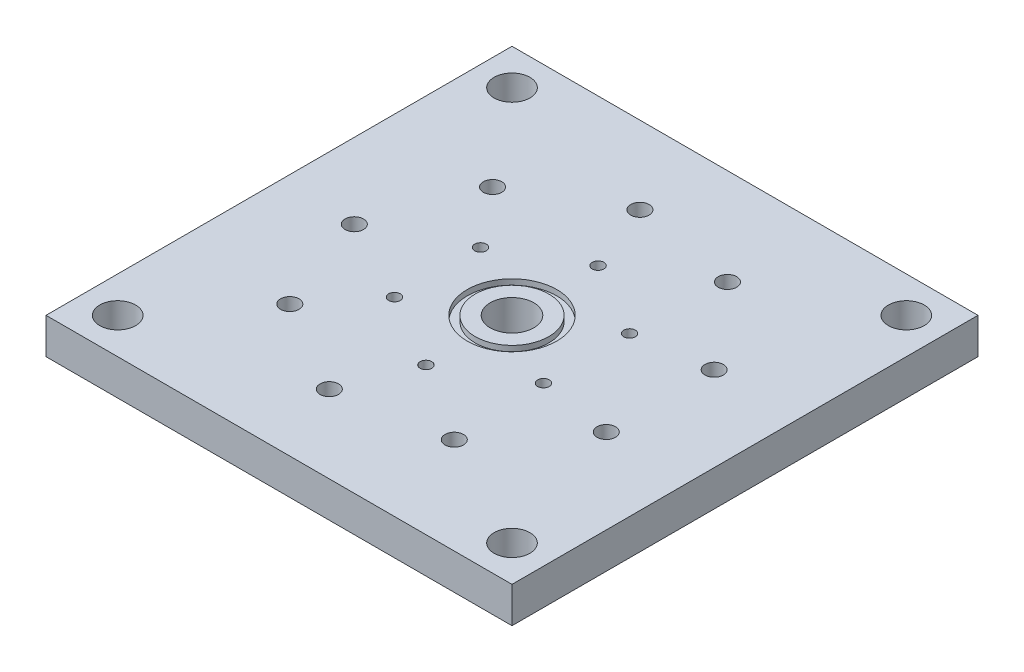
ISO-10303-21;
HEADER;
FILE_DESCRIPTION(('STEP AP214'),'2;1');
FILE_NAME('part.step','',(''),(''),'','','');
FILE_SCHEMA(('AUTOMOTIVE_DESIGN { 1 0 10303 214 1 1 1 1 }'));
ENDSEC;
DATA;
#1=APPLICATION_CONTEXT('core data for automotive mechanical design processes');
#2=APPLICATION_PROTOCOL_DEFINITION('international standard','automotive_design',2000,#1);
#3=PRODUCT_CONTEXT('',#1,'mechanical');
#4=PRODUCT('Part','Part','',(#3));
#5=PRODUCT_RELATED_PRODUCT_CATEGORY('part','',(#4));
#6=PRODUCT_DEFINITION_FORMATION('','',#4);
#7=PRODUCT_DEFINITION_CONTEXT('part definition',#1,'design');
#8=PRODUCT_DEFINITION('design','',#6,#7);
#9=PRODUCT_DEFINITION_SHAPE('','',#8);
#10=(LENGTH_UNIT() NAMED_UNIT(*) SI_UNIT(.MILLI.,.METRE.));
#11=(NAMED_UNIT(*) PLANE_ANGLE_UNIT() SI_UNIT($,.RADIAN.));
#12=(NAMED_UNIT(*) SI_UNIT($,.STERADIAN.) SOLID_ANGLE_UNIT());
#13=UNCERTAINTY_MEASURE_WITH_UNIT(LENGTH_MEASURE(1.E-05),#10,'distance_accuracy_value','');
#14=(GEOMETRIC_REPRESENTATION_CONTEXT(3) GLOBAL_UNCERTAINTY_ASSIGNED_CONTEXT((#13)) GLOBAL_UNIT_ASSIGNED_CONTEXT((#10,
#11,#12)) REPRESENTATION_CONTEXT('',''));
#15=CARTESIAN_POINT('',(0.,0.,0.));
#16=DIRECTION('',(0.,0.,1.));
#17=DIRECTION('',(1.,0.,0.));
#18=AXIS2_PLACEMENT_3D('',#15,#16,#17);
#19=CARTESIAN_POINT('',(0.,6.35,0.));
#20=DIRECTION('',(0.,-1.,0.));
#21=DIRECTION('',(0.,0.,-1.));
#22=AXIS2_PLACEMENT_3D('',#19,#20,#21);
#23=PLANE('',#22);
#24=CARTESIAN_POINT('',(0.,6.35,0.));
#25=DIRECTION('',(0.,1.,0.));
#26=DIRECTION('',(0.,0.,1.));
#27=AXIS2_PLACEMENT_3D('',#24,#25,#26);
#28=CIRCLE('',#27,3.8608);
#29=CARTESIAN_POINT('',(0.,6.35,3.8608));
#30=VERTEX_POINT('',#29);
#31=EDGE_CURVE('E100',#30,#30,#28,.T.);
#32=ORIENTED_EDGE('',*,*,#31,.F.);
#33=EDGE_LOOP('',(#32));
#34=FACE_BOUND('',#33,.T.);
#35=CARTESIAN_POINT('',(0.,6.35,0.));
#36=DIRECTION('',(0.,1.,0.));
#37=DIRECTION('',(0.,0.,1.));
#38=AXIS2_PLACEMENT_3D('',#35,#36,#37);
#39=CIRCLE('',#38,6.5278);
#40=CARTESIAN_POINT('',(0.,6.35,6.5278));
#41=VERTEX_POINT('',#40);
#42=EDGE_CURVE('E123',#41,#41,#39,.T.);
#43=ORIENTED_EDGE('',*,*,#42,.T.);
#44=EDGE_LOOP('',(#43));
#45=FACE_BOUND('',#44,.T.);
#46=ADVANCED_FACE('F33',(#34,#45),#23,.F.);
#47=CARTESIAN_POINT('',(41.275,6.35,41.275));
#48=DIRECTION('',(-1.,0.,0.));
#49=DIRECTION('',(0.,0.,1.));
#50=AXIS2_PLACEMENT_3D('',#47,#48,#49);
#51=PLANE('',#50);
#52=DIRECTION('',(0.,0.,-1.));
#53=VECTOR('',#52,1.);
#54=CARTESIAN_POINT('',(41.275,0.,41.275));
#55=LINE('',#54,#53);
#56=CARTESIAN_POINT('',(41.275,0.,41.275));
#57=VERTEX_POINT('',#56);
#58=CARTESIAN_POINT('',(41.275,0.,-41.275));
#59=VERTEX_POINT('',#58);
#60=EDGE_CURVE('E97',#57,#59,#55,.T.);
#61=ORIENTED_EDGE('',*,*,#60,.T.);
#62=DIRECTION('',(0.,-1.,0.));
#63=VECTOR('',#62,1.);
#64=CARTESIAN_POINT('',(41.275,6.35,-41.275));
#65=LINE('',#64,#63);
#66=CARTESIAN_POINT('',(41.275,6.35,-41.275));
#67=VERTEX_POINT('',#66);
#68=EDGE_CURVE('E11',#67,#59,#65,.T.);
#69=ORIENTED_EDGE('',*,*,#68,.F.);
#70=DIRECTION('',(0.,0.,-1.));
#71=VECTOR('',#70,1.);
#72=CARTESIAN_POINT('',(41.275,6.35,41.275));
#73=LINE('',#72,#71);
#74=CARTESIAN_POINT('',(41.275,6.35,41.275));
#75=VERTEX_POINT('',#74);
#76=EDGE_CURVE('E85',#75,#67,#73,.T.);
#77=ORIENTED_EDGE('',*,*,#76,.F.);
#78=DIRECTION('',(0.,-1.,0.));
#79=VECTOR('',#78,1.);
#80=CARTESIAN_POINT('',(41.275,6.35,41.275));
#81=LINE('',#80,#79);
#82=EDGE_CURVE('E93',#75,#57,#81,.T.);
#83=ORIENTED_EDGE('',*,*,#82,.T.);
#84=EDGE_LOOP('',(#61,#69,#77,#83));
#85=FACE_BOUND('',#84,.T.);
#86=ADVANCED_FACE('F35',(#85),#51,.F.);
#87=CARTESIAN_POINT('',(-41.275,6.35,-41.275));
#88=DIRECTION('',(0.,0.,1.));
#89=DIRECTION('',(1.,0.,0.));
#90=AXIS2_PLACEMENT_3D('',#87,#88,#89);
#91=PLANE('',#90);
#92=DIRECTION('',(-1.,0.,0.));
#93=VECTOR('',#92,1.);
#94=CARTESIAN_POINT('',(-41.275,0.,-41.275));
#95=LINE('',#94,#93);
#96=CARTESIAN_POINT('',(-41.275,0.,-41.275));
#97=VERTEX_POINT('',#96);
#98=EDGE_CURVE('E89',#59,#97,#95,.T.);
#99=ORIENTED_EDGE('',*,*,#98,.T.);
#100=DIRECTION('',(0.,-1.,0.));
#101=VECTOR('',#100,1.);
#102=CARTESIAN_POINT('',(-41.275,6.35,-41.275));
#103=LINE('',#102,#101);
#104=CARTESIAN_POINT('',(-41.275,6.35,-41.275));
#105=VERTEX_POINT('',#104);
#106=EDGE_CURVE('E42',#105,#97,#103,.T.);
#107=ORIENTED_EDGE('',*,*,#106,.F.);
#108=DIRECTION('',(-1.,0.,0.));
#109=VECTOR('',#108,1.);
#110=CARTESIAN_POINT('',(-41.275,6.35,-41.275));
#111=LINE('',#110,#109);
#112=EDGE_CURVE('E80',#67,#105,#111,.T.);
#113=ORIENTED_EDGE('',*,*,#112,.F.);
#114=ORIENTED_EDGE('',*,*,#68,.T.);
#115=EDGE_LOOP('',(#99,#107,#113,#114));
#116=FACE_BOUND('',#115,.T.);
#117=ADVANCED_FACE('F88',(#116),#91,.F.);
#118=CARTESIAN_POINT('',(-41.275,6.35,41.275));
#119=DIRECTION('',(1.,0.,0.));
#120=DIRECTION('',(0.,0.,-1.));
#121=AXIS2_PLACEMENT_3D('',#118,#119,#120);
#122=PLANE('',#121);
#123=DIRECTION('',(0.,0.,1.));
#124=VECTOR('',#123,1.);
#125=CARTESIAN_POINT('',(-41.275,0.,41.275));
#126=LINE('',#125,#124);
#127=CARTESIAN_POINT('',(-41.275,0.,41.275));
#128=VERTEX_POINT('',#127);
#129=EDGE_CURVE('E67',#97,#128,#126,.T.);
#130=ORIENTED_EDGE('',*,*,#129,.T.);
#131=DIRECTION('',(0.,-1.,0.));
#132=VECTOR('',#131,1.);
#133=CARTESIAN_POINT('',(-41.275,6.35,41.275));
#134=LINE('',#133,#132);
#135=CARTESIAN_POINT('',(-41.275,6.35,41.275));
#136=VERTEX_POINT('',#135);
#137=EDGE_CURVE('E90',#136,#128,#134,.T.);
#138=ORIENTED_EDGE('',*,*,#137,.F.);
#139=DIRECTION('',(0.,0.,1.));
#140=VECTOR('',#139,1.);
#141=CARTESIAN_POINT('',(-41.275,6.35,41.275));
#142=LINE('',#141,#140);
#143=EDGE_CURVE('E83',#105,#136,#142,.T.);
#144=ORIENTED_EDGE('',*,*,#143,.F.);
#145=ORIENTED_EDGE('',*,*,#106,.T.);
#146=EDGE_LOOP('',(#130,#138,#144,#145));
#147=FACE_BOUND('',#146,.T.);
#148=ADVANCED_FACE('F91',(#147),#122,.F.);
#149=CARTESIAN_POINT('',(-41.275,6.35,41.275));
#150=DIRECTION('',(0.,0.,-1.));
#151=DIRECTION('',(-1.,0.,0.));
#152=AXIS2_PLACEMENT_3D('',#149,#150,#151);
#153=PLANE('',#152);
#154=DIRECTION('',(1.,0.,0.));
#155=VECTOR('',#154,1.);
#156=CARTESIAN_POINT('',(-41.275,0.,41.275));
#157=LINE('',#156,#155);
#158=EDGE_CURVE('E73',#128,#57,#157,.T.);
#159=ORIENTED_EDGE('',*,*,#158,.T.);
#160=ORIENTED_EDGE('',*,*,#82,.F.);
#161=DIRECTION('',(1.,0.,0.));
#162=VECTOR('',#161,1.);
#163=CARTESIAN_POINT('',(-41.275,6.35,41.275));
#164=LINE('',#163,#162);
#165=EDGE_CURVE('E50',#136,#75,#164,.T.);
#166=ORIENTED_EDGE('',*,*,#165,.F.);
#167=ORIENTED_EDGE('',*,*,#137,.T.);
#168=EDGE_LOOP('',(#159,#160,#166,#167));
#169=FACE_BOUND('',#168,.T.);
#170=ADVANCED_FACE('F105',(#169),#153,.F.);
#171=CARTESIAN_POINT('',(-34.925,6.35,-34.925));
#172=DIRECTION('',(0.,1.,0.));
#173=DIRECTION('',(0.,0.,-1.));
#174=AXIS2_PLACEMENT_3D('',#171,#172,#173);
#175=CIRCLE('',#174,3.175);
#176=CARTESIAN_POINT('',(-34.925,6.35,-38.1));
#177=VERTEX_POINT('',#176);
#178=EDGE_CURVE('E234',#177,#177,#175,.T.);
#179=ORIENTED_EDGE('',*,*,#178,.F.);
#180=EDGE_LOOP('',(#179));
#181=FACE_BOUND('',#180,.T.);
#182=CARTESIAN_POINT('',(-34.925,6.35,34.925));
#183=DIRECTION('',(0.,1.,0.));
#184=DIRECTION('',(0.,0.,1.));
#185=AXIS2_PLACEMENT_3D('',#182,#183,#184);
#186=CIRCLE('',#185,3.175);
#187=CARTESIAN_POINT('',(-34.925,6.35,38.1));
#188=VERTEX_POINT('',#187);
#189=EDGE_CURVE('E228',#188,#188,#186,.T.);
#190=ORIENTED_EDGE('',*,*,#189,.F.);
#191=EDGE_LOOP('',(#190));
#192=FACE_BOUND('',#191,.T.);
#193=CARTESIAN_POINT('',(34.925,6.35,34.925));
#194=DIRECTION('',(0.,1.,0.));
#195=DIRECTION('',(0.,0.,-1.));
#196=AXIS2_PLACEMENT_3D('',#193,#194,#195);
#197=CIRCLE('',#196,3.175);
#198=CARTESIAN_POINT('',(34.925,6.35,31.75));
#199=VERTEX_POINT('',#198);
#200=EDGE_CURVE('E222',#199,#199,#197,.T.);
#201=ORIENTED_EDGE('',*,*,#200,.F.);
#202=EDGE_LOOP('',(#201));
#203=FACE_BOUND('',#202,.T.);
#204=CARTESIAN_POINT('',(34.925,6.35,-34.925));
#205=DIRECTION('',(0.,1.,0.));
#206=DIRECTION('',(0.,0.,1.));
#207=AXIS2_PLACEMENT_3D('',#204,#205,#206);
#208=CIRCLE('',#207,3.175);
#209=CARTESIAN_POINT('',(34.925,6.35,-31.75));
#210=VERTEX_POINT('',#209);
#211=EDGE_CURVE('E216',#210,#210,#208,.T.);
#212=ORIENTED_EDGE('',*,*,#211,.F.);
#213=EDGE_LOOP('',(#212));
#214=FACE_BOUND('',#213,.T.);
#215=CARTESIAN_POINT('',(-4.8517300840137,6.35,27.5155286191612));
#216=DIRECTION('',(0.,1.,0.));
#217=DIRECTION('',(-0.64278760968653,0.,0.766044443118986));
#218=AXIS2_PLACEMENT_3D('',#215,#216,#217);
#219=CIRCLE('',#218,1.63195);
#220=CARTESIAN_POINT('',(-5.90072732364164,6.35,28.7656748481092));
#221=VERTEX_POINT('',#220);
#222=EDGE_CURVE('E210',#221,#221,#219,.T.);
#223=ORIENTED_EDGE('',*,*,#222,.F.);
#224=EDGE_LOOP('',(#223));
#225=FACE_BOUND('',#224,.T.);
#226=CARTESIAN_POINT('',(-21.4032817407441,6.35,17.9594858146421));
#227=DIRECTION('',(0.,1.,0.));
#228=DIRECTION('',(-0.984807753012206,0.,0.17364817766694));
#229=AXIS2_PLACEMENT_3D('',#226,#227,#228);
#230=CIRCLE('',#229,1.63195);
#231=CARTESIAN_POINT('',(-23.0104387532723,6.35,18.2428709581857));
#232=VERTEX_POINT('',#231);
#233=EDGE_CURVE('E204',#232,#232,#230,.T.);
#234=ORIENTED_EDGE('',*,*,#233,.F.);
#235=EDGE_LOOP('',(#234));
#236=FACE_BOUND('',#235,.T.);
#237=CARTESIAN_POINT('',(-27.94,6.35,2.60208521396521E-13));
#238=DIRECTION('',(0.,1.,0.));
#239=DIRECTION('',(-0.866025403784443,0.,-0.499999999999992));
#240=AXIS2_PLACEMENT_3D('',#237,#238,#239);
#241=CIRCLE('',#240,1.63195);
#242=CARTESIAN_POINT('',(-29.353310157706,6.35,-0.815974999999728));
#243=VERTEX_POINT('',#242);
#244=EDGE_CURVE('E198',#243,#243,#241,.T.);
#245=ORIENTED_EDGE('',*,*,#244,.F.);
#246=EDGE_LOOP('',(#245));
#247=FACE_BOUND('',#246,.T.);
#248=CARTESIAN_POINT('',(-21.4032817407444,6.35,-17.9594858146418));
#249=DIRECTION('',(0.,1.,0.));
#250=DIRECTION('',(-0.342020143325676,0.,-0.939692620785906));
#251=AXIS2_PLACEMENT_3D('',#248,#249,#250);
#252=CIRCLE('',#251,1.63195);
#253=CARTESIAN_POINT('',(-21.9614415136447,6.35,-19.4930171871333));
#254=VERTEX_POINT('',#253);
#255=EDGE_CURVE('E192',#254,#254,#252,.T.);
#256=ORIENTED_EDGE('',*,*,#255,.F.);
#257=EDGE_LOOP('',(#256));
#258=FACE_BOUND('',#257,.T.);
#259=CARTESIAN_POINT('',(-4.8517300840142,6.35,-27.5155286191611));
#260=DIRECTION('',(0.,1.,0.));
#261=DIRECTION('',(0.342020143325663,0.,-0.939692620785911));
#262=AXIS2_PLACEMENT_3D('',#259,#260,#261);
#263=CIRCLE('',#262,1.63195);
#264=CARTESIAN_POINT('',(-4.29357031111389,6.35,-29.0490599916526));
#265=VERTEX_POINT('',#264);
#266=EDGE_CURVE('E186',#265,#265,#263,.T.);
#267=ORIENTED_EDGE('',*,*,#266,.F.);
#268=EDGE_LOOP('',(#267));
#269=FACE_BOUND('',#268,.T.);
#270=CARTESIAN_POINT('',(13.9699999999999,6.35,-24.1967497817373));
#271=DIRECTION('',(0.,1.,0.));
#272=DIRECTION('',(0.866025403784436,0.,-0.500000000000004));
#273=AXIS2_PLACEMENT_3D('',#270,#271,#272);
#274=CIRCLE('',#273,1.63195);
#275=CARTESIAN_POINT('',(15.3833101577059,6.35,-25.0127247817373));
#276=VERTEX_POINT('',#275);
#277=EDGE_CURVE('E180',#276,#276,#274,.T.);
#278=ORIENTED_EDGE('',*,*,#277,.F.);
#279=EDGE_LOOP('',(#278));
#280=FACE_BOUND('',#279,.T.);
#281=CARTESIAN_POINT('',(26.2550118247583,6.35,-9.55604280451927));
#282=DIRECTION('',(0.,1.,0.));
#283=DIRECTION('',(0.984807753012209,0.,0.173648177666927));
#284=AXIS2_PLACEMENT_3D('',#281,#282,#283);
#285=CIRCLE('',#284,1.63195);
#286=CARTESIAN_POINT('',(27.8621688372865,6.35,-9.27265766097573));
#287=VERTEX_POINT('',#286);
#288=EDGE_CURVE('E174',#287,#287,#285,.T.);
#289=ORIENTED_EDGE('',*,*,#288,.F.);
#290=EDGE_LOOP('',(#289));
#291=FACE_BOUND('',#290,.T.);
#292=CARTESIAN_POINT('',(26.2550118247583,6.35,9.55604280451915));
#293=DIRECTION('',(0.,1.,0.));
#294=DIRECTION('',(0.642787609686541,0.,0.766044443118977));
#295=AXIS2_PLACEMENT_3D('',#292,#293,#294);
#296=CIRCLE('',#295,1.63195);
#297=CARTESIAN_POINT('',(27.3040090643863,6.35,10.8061890334672));
#298=VERTEX_POINT('',#297);
#299=EDGE_CURVE('E168',#298,#298,#296,.T.);
#300=ORIENTED_EDGE('',*,*,#299,.F.);
#301=EDGE_LOOP('',(#300));
#302=FACE_BOUND('',#301,.T.);
#303=CARTESIAN_POINT('',(13.97,6.35,24.1967497817372));
#304=DIRECTION('',(0.,1.,0.));
#305=DIRECTION('',(0.,0.,1.));
#306=AXIS2_PLACEMENT_3D('',#303,#304,#305);
#307=CIRCLE('',#306,1.63195);
#308=CARTESIAN_POINT('',(13.97,6.35,25.8286997817372));
#309=VERTEX_POINT('',#308);
#310=EDGE_CURVE('E162',#309,#309,#307,.T.);
#311=ORIENTED_EDGE('',*,*,#310,.F.);
#312=EDGE_LOOP('',(#311));
#313=FACE_BOUND('',#312,.T.);
#314=CARTESIAN_POINT('',(-13.1982271536748,6.35,7.62000000000015));
#315=DIRECTION('',(0.,1.,0.));
#316=DIRECTION('',(-0.866025403784433,0.,0.50000000000001));
#317=AXIS2_PLACEMENT_3D('',#314,#315,#316);
#318=CIRCLE('',#317,1.03251);
#319=CARTESIAN_POINT('',(-14.0924070433362,6.35,8.13625500000017));
#320=VERTEX_POINT('',#319);
#321=EDGE_CURVE('E159',#320,#320,#318,.T.);
#322=ORIENTED_EDGE('',*,*,#321,.F.);
#323=EDGE_LOOP('',(#322));
#324=FACE_BOUND('',#323,.T.);
#325=CARTESIAN_POINT('',(-13.1982271536749,6.35,-7.61999999999988));
#326=DIRECTION('',(0.,1.,0.));
#327=DIRECTION('',(-0.866025403784443,0.,-0.499999999999992));
#328=AXIS2_PLACEMENT_3D('',#325,#326,#327);
#329=CIRCLE('',#328,1.03251);
#330=CARTESIAN_POINT('',(-14.0924070433364,6.35,-8.13625499999987));
#331=VERTEX_POINT('',#330);
#332=EDGE_CURVE('E153',#331,#331,#329,.T.);
#333=ORIENTED_EDGE('',*,*,#332,.F.);
#334=EDGE_LOOP('',(#333));
#335=FACE_BOUND('',#334,.T.);
#336=CARTESIAN_POINT('',(0.,6.35,-15.24));
#337=DIRECTION('',(0.,1.,0.));
#338=DIRECTION('',(0.,0.,-1.));
#339=AXIS2_PLACEMENT_3D('',#336,#337,#338);
#340=CIRCLE('',#339,1.03251);
#341=CARTESIAN_POINT('',(0.,6.35,-16.27251));
#342=VERTEX_POINT('',#341);
#343=EDGE_CURVE('E147',#342,#342,#340,.T.);
#344=ORIENTED_EDGE('',*,*,#343,.F.);
#345=EDGE_LOOP('',(#344));
#346=FACE_BOUND('',#345,.T.);
#347=CARTESIAN_POINT('',(13.1982271536748,6.35,-7.62000000000006));
#348=DIRECTION('',(0.,1.,0.));
#349=DIRECTION('',(0.866025403784436,0.,-0.500000000000004));
#350=AXIS2_PLACEMENT_3D('',#347,#348,#349);
#351=CIRCLE('',#350,1.03251);
#352=CARTESIAN_POINT('',(14.0924070433363,6.35,-8.13625500000007));
#353=VERTEX_POINT('',#352);
#354=EDGE_CURVE('E141',#353,#353,#351,.T.);
#355=ORIENTED_EDGE('',*,*,#354,.F.);
#356=EDGE_LOOP('',(#355));
#357=FACE_BOUND('',#356,.T.);
#358=CARTESIAN_POINT('',(13.1982271536749,6.35,7.61999999999997));
#359=DIRECTION('',(0.,1.,0.));
#360=DIRECTION('',(0.86602540378444,0.,0.499999999999998));
#361=AXIS2_PLACEMENT_3D('',#358,#359,#360);
#362=CIRCLE('',#361,1.03251);
#363=CARTESIAN_POINT('',(14.0924070433363,6.35,8.13625499999997));
#364=VERTEX_POINT('',#363);
#365=EDGE_CURVE('E135',#364,#364,#362,.T.);
#366=ORIENTED_EDGE('',*,*,#365,.F.);
#367=EDGE_LOOP('',(#366));
#368=FACE_BOUND('',#367,.T.);
#369=CARTESIAN_POINT('',(0.,6.35,15.24));
#370=DIRECTION('',(0.,1.,0.));
#371=DIRECTION('',(0.,0.,1.));
#372=AXIS2_PLACEMENT_3D('',#369,#370,#371);
#373=CIRCLE('',#372,1.03251);
#374=CARTESIAN_POINT('',(0.,6.35,16.27251));
#375=VERTEX_POINT('',#374);
#376=EDGE_CURVE('E129',#375,#375,#373,.T.);
#377=ORIENTED_EDGE('',*,*,#376,.F.);
#378=EDGE_LOOP('',(#377));
#379=FACE_BOUND('',#378,.T.);
#380=CARTESIAN_POINT('',(0.,6.35,0.));
#381=DIRECTION('',(0.,1.,0.));
#382=DIRECTION('',(0.,0.,1.));
#383=AXIS2_PLACEMENT_3D('',#380,#381,#382);
#384=CIRCLE('',#383,7.9248);
#385=CARTESIAN_POINT('',(0.,6.35,7.9248));
#386=VERTEX_POINT('',#385);
#387=EDGE_CURVE('E117',#386,#386,#384,.T.);
#388=ORIENTED_EDGE('',*,*,#387,.F.);
#389=EDGE_LOOP('',(#388));
#390=FACE_BOUND('',#389,.T.);
#391=ORIENTED_EDGE('',*,*,#76,.T.);
#392=ORIENTED_EDGE('',*,*,#112,.T.);
#393=ORIENTED_EDGE('',*,*,#143,.T.);
#394=ORIENTED_EDGE('',*,*,#165,.T.);
#395=EDGE_LOOP('',(#391,#392,#393,#394));
#396=FACE_BOUND('',#395,.T.);
#397=ADVANCED_FACE('F81',(#181,#192,#203,#214,#225,#236,#247,#258,#269,#280,#291,#302,#313,#324,
#335,#346,#357,#368,#379,#390,#396),#23,.F.);
#398=CARTESIAN_POINT('',(0.,0.,0.));
#399=DIRECTION('',(0.,-1.,0.));
#400=DIRECTION('',(0.,0.,-1.));
#401=AXIS2_PLACEMENT_3D('',#398,#399,#400);
#402=PLANE('',#401);
#403=CARTESIAN_POINT('',(-34.925,0.,-34.925));
#404=DIRECTION('',(0.,-1.,0.));
#405=DIRECTION('',(0.,0.,-1.));
#406=AXIS2_PLACEMENT_3D('',#403,#404,#405);
#407=CIRCLE('',#406,3.175);
#408=CARTESIAN_POINT('',(-34.925,0.,-38.1));
#409=VERTEX_POINT('',#408);
#410=EDGE_CURVE('E237',#409,#409,#407,.F.);
#411=ORIENTED_EDGE('',*,*,#410,.T.);
#412=EDGE_LOOP('',(#411));
#413=FACE_BOUND('',#412,.T.);
#414=CARTESIAN_POINT('',(-34.925,0.,34.925));
#415=DIRECTION('',(0.,-1.,0.));
#416=DIRECTION('',(0.,0.,-1.));
#417=AXIS2_PLACEMENT_3D('',#414,#415,#416);
#418=CIRCLE('',#417,3.175);
#419=CARTESIAN_POINT('',(-34.925,0.,31.75));
#420=VERTEX_POINT('',#419);
#421=EDGE_CURVE('E231',#420,#420,#418,.F.);
#422=ORIENTED_EDGE('',*,*,#421,.T.);
#423=EDGE_LOOP('',(#422));
#424=FACE_BOUND('',#423,.T.);
#425=CARTESIAN_POINT('',(34.925,0.,34.925));
#426=DIRECTION('',(0.,-1.,0.));
#427=DIRECTION('',(0.,0.,-1.));
#428=AXIS2_PLACEMENT_3D('',#425,#426,#427);
#429=CIRCLE('',#428,3.175);
#430=CARTESIAN_POINT('',(34.925,0.,31.75));
#431=VERTEX_POINT('',#430);
#432=EDGE_CURVE('E225',#431,#431,#429,.F.);
#433=ORIENTED_EDGE('',*,*,#432,.T.);
#434=EDGE_LOOP('',(#433));
#435=FACE_BOUND('',#434,.T.);
#436=CARTESIAN_POINT('',(34.925,0.,-34.925));
#437=DIRECTION('',(0.,-1.,0.));
#438=DIRECTION('',(0.,0.,-1.));
#439=AXIS2_PLACEMENT_3D('',#436,#437,#438);
#440=CIRCLE('',#439,3.175);
#441=CARTESIAN_POINT('',(34.925,0.,-38.1));
#442=VERTEX_POINT('',#441);
#443=EDGE_CURVE('E219',#442,#442,#440,.F.);
#444=ORIENTED_EDGE('',*,*,#443,.T.);
#445=EDGE_LOOP('',(#444));
#446=FACE_BOUND('',#445,.T.);
#447=CARTESIAN_POINT('',(-4.8517300840137,0.,27.5155286191612));
#448=DIRECTION('',(0.,-1.,0.));
#449=DIRECTION('',(0.,0.,-1.));
#450=AXIS2_PLACEMENT_3D('',#447,#448,#449);
#451=CIRCLE('',#450,1.63195);
#452=CARTESIAN_POINT('',(-4.8517300840137,0.,25.8835786191612));
#453=VERTEX_POINT('',#452);
#454=EDGE_CURVE('E213',#453,#453,#451,.F.);
#455=ORIENTED_EDGE('',*,*,#454,.T.);
#456=EDGE_LOOP('',(#455));
#457=FACE_BOUND('',#456,.T.);
#458=CARTESIAN_POINT('',(-21.4032817407441,0.,17.9594858146421));
#459=DIRECTION('',(0.,-1.,0.));
#460=DIRECTION('',(0.,0.,-1.));
#461=AXIS2_PLACEMENT_3D('',#458,#459,#460);
#462=CIRCLE('',#461,1.63195);
#463=CARTESIAN_POINT('',(-21.4032817407441,0.,16.3275358146421));
#464=VERTEX_POINT('',#463);
#465=EDGE_CURVE('E207',#464,#464,#462,.F.);
#466=ORIENTED_EDGE('',*,*,#465,.T.);
#467=EDGE_LOOP('',(#466));
#468=FACE_BOUND('',#467,.T.);
#469=CARTESIAN_POINT('',(-27.94,0.,2.60208521396521E-13));
#470=DIRECTION('',(0.,-1.,0.));
#471=DIRECTION('',(0.,0.,-1.));
#472=AXIS2_PLACEMENT_3D('',#469,#470,#471);
#473=CIRCLE('',#472,1.63195);
#474=CARTESIAN_POINT('',(-27.94,0.,-1.63194999999974));
#475=VERTEX_POINT('',#474);
#476=EDGE_CURVE('E201',#475,#475,#473,.F.);
#477=ORIENTED_EDGE('',*,*,#476,.T.);
#478=EDGE_LOOP('',(#477));
#479=FACE_BOUND('',#478,.T.);
#480=CARTESIAN_POINT('',(-21.4032817407444,0.,-17.9594858146418));
#481=DIRECTION('',(0.,-1.,0.));
#482=DIRECTION('',(0.,0.,-1.));
#483=AXIS2_PLACEMENT_3D('',#480,#481,#482);
#484=CIRCLE('',#483,1.63195);
#485=CARTESIAN_POINT('',(-21.4032817407444,0.,-19.5914358146418));
#486=VERTEX_POINT('',#485);
#487=EDGE_CURVE('E195',#486,#486,#484,.F.);
#488=ORIENTED_EDGE('',*,*,#487,.T.);
#489=EDGE_LOOP('',(#488));
#490=FACE_BOUND('',#489,.T.);
#491=CARTESIAN_POINT('',(-4.8517300840142,0.,-27.5155286191611));
#492=DIRECTION('',(0.,-1.,0.));
#493=DIRECTION('',(0.,0.,-1.));
#494=AXIS2_PLACEMENT_3D('',#491,#492,#493);
#495=CIRCLE('',#494,1.63195);
#496=CARTESIAN_POINT('',(-4.8517300840142,0.,-29.1474786191611));
#497=VERTEX_POINT('',#496);
#498=EDGE_CURVE('E189',#497,#497,#495,.F.);
#499=ORIENTED_EDGE('',*,*,#498,.T.);
#500=EDGE_LOOP('',(#499));
#501=FACE_BOUND('',#500,.T.);
#502=CARTESIAN_POINT('',(13.9699999999999,0.,-24.1967497817373));
#503=DIRECTION('',(0.,-1.,0.));
#504=DIRECTION('',(0.,0.,-1.));
#505=AXIS2_PLACEMENT_3D('',#502,#503,#504);
#506=CIRCLE('',#505,1.63195);
#507=CARTESIAN_POINT('',(13.9699999999999,0.,-25.8286997817373));
#508=VERTEX_POINT('',#507);
#509=EDGE_CURVE('E183',#508,#508,#506,.F.);
#510=ORIENTED_EDGE('',*,*,#509,.T.);
#511=EDGE_LOOP('',(#510));
#512=FACE_BOUND('',#511,.T.);
#513=CARTESIAN_POINT('',(26.2550118247583,0.,-9.55604280451927));
#514=DIRECTION('',(0.,-1.,0.));
#515=DIRECTION('',(0.,0.,-1.));
#516=AXIS2_PLACEMENT_3D('',#513,#514,#515);
#517=CIRCLE('',#516,1.63195);
#518=CARTESIAN_POINT('',(26.2550118247583,0.,-11.1879928045193));
#519=VERTEX_POINT('',#518);
#520=EDGE_CURVE('E177',#519,#519,#517,.F.);
#521=ORIENTED_EDGE('',*,*,#520,.T.);
#522=EDGE_LOOP('',(#521));
#523=FACE_BOUND('',#522,.T.);
#524=CARTESIAN_POINT('',(26.2550118247583,0.,9.55604280451915));
#525=DIRECTION('',(0.,-1.,0.));
#526=DIRECTION('',(0.,0.,-1.));
#527=AXIS2_PLACEMENT_3D('',#524,#525,#526);
#528=CIRCLE('',#527,1.63195);
#529=CARTESIAN_POINT('',(26.2550118247583,0.,7.92409280451915));
#530=VERTEX_POINT('',#529);
#531=EDGE_CURVE('E171',#530,#530,#528,.F.);
#532=ORIENTED_EDGE('',*,*,#531,.T.);
#533=EDGE_LOOP('',(#532));
#534=FACE_BOUND('',#533,.T.);
#535=CARTESIAN_POINT('',(13.97,0.,24.1967497817372));
#536=DIRECTION('',(0.,-1.,0.));
#537=DIRECTION('',(0.,0.,-1.));
#538=AXIS2_PLACEMENT_3D('',#535,#536,#537);
#539=CIRCLE('',#538,1.63195);
#540=CARTESIAN_POINT('',(13.97,0.,22.5647997817372));
#541=VERTEX_POINT('',#540);
#542=EDGE_CURVE('E165',#541,#541,#539,.F.);
#543=ORIENTED_EDGE('',*,*,#542,.T.);
#544=EDGE_LOOP('',(#543));
#545=FACE_BOUND('',#544,.T.);
#546=CARTESIAN_POINT('',(0.,0.,0.));
#547=DIRECTION('',(0.,-1.,0.));
#548=DIRECTION('',(0.,0.,-1.));
#549=AXIS2_PLACEMENT_3D('',#546,#547,#548);
#550=CIRCLE('',#549,3.8608);
#551=CARTESIAN_POINT('',(0.,0.,-3.8608));
#552=VERTEX_POINT('',#551);
#553=EDGE_CURVE('E111',#552,#552,#550,.F.);
#554=ORIENTED_EDGE('',*,*,#553,.T.);
#555=EDGE_LOOP('',(#554));
#556=FACE_BOUND('',#555,.T.);
#557=ORIENTED_EDGE('',*,*,#60,.F.);
#558=ORIENTED_EDGE('',*,*,#158,.F.);
#559=ORIENTED_EDGE('',*,*,#129,.F.);
#560=ORIENTED_EDGE('',*,*,#98,.F.);
#561=EDGE_LOOP('',(#557,#558,#559,#560));
#562=FACE_BOUND('',#561,.T.);
#563=ADVANCED_FACE('F108',(#413,#424,#435,#446,#457,#468,#479,#490,#501,#512,#523,#534,#545,
#556,#562),#402,.T.);
#564=CARTESIAN_POINT('',(0.,-0.00100000000000013,0.));
#565=DIRECTION('',(0.,1.,0.));
#566=DIRECTION('',(0.,0.,1.));
#567=AXIS2_PLACEMENT_3D('',#564,#565,#566);
#568=CYLINDRICAL_SURFACE('',#567,3.8608);
#569=ORIENTED_EDGE('',*,*,#553,.F.);
#570=EDGE_LOOP('',(#569));
#571=FACE_BOUND('',#570,.T.);
#572=ORIENTED_EDGE('',*,*,#31,.T.);
#573=EDGE_LOOP('',(#572));
#574=FACE_BOUND('',#573,.T.);
#575=ADVANCED_FACE('F289',(#571,#574),#568,.F.);
#576=CARTESIAN_POINT('',(0.,5.3721,0.));
#577=DIRECTION('',(0.,1.,0.));
#578=DIRECTION('',(0.,0.,1.));
#579=AXIS2_PLACEMENT_3D('',#576,#577,#578);
#580=CYLINDRICAL_SURFACE('',#579,7.9248);
#581=CARTESIAN_POINT('',(0.,5.3721,0.));
#582=DIRECTION('',(0.,1.,0.));
#583=DIRECTION('',(0.,0.,1.));
#584=AXIS2_PLACEMENT_3D('',#581,#582,#583);
#585=CIRCLE('',#584,7.9248);
#586=CARTESIAN_POINT('',(0.,5.3721,7.9248));
#587=VERTEX_POINT('',#586);
#588=EDGE_CURVE('E114',#587,#587,#585,.T.);
#589=ORIENTED_EDGE('',*,*,#588,.F.);
#590=EDGE_LOOP('',(#589));
#591=FACE_BOUND('',#590,.T.);
#592=ORIENTED_EDGE('',*,*,#387,.T.);
#593=EDGE_LOOP('',(#592));
#594=FACE_BOUND('',#593,.T.);
#595=ADVANCED_FACE('F286',(#591,#594),#580,.F.);
#596=CARTESIAN_POINT('',(0.,5.3721,0.));
#597=DIRECTION('',(0.,1.,0.));
#598=DIRECTION('',(0.,0.,1.));
#599=AXIS2_PLACEMENT_3D('',#596,#597,#598);
#600=PLANE('',#599);
#601=CARTESIAN_POINT('',(0.,5.3721,0.));
#602=DIRECTION('',(0.,1.,0.));
#603=DIRECTION('',(0.,0.,1.));
#604=AXIS2_PLACEMENT_3D('',#601,#602,#603);
#605=CIRCLE('',#604,6.5278);
#606=CARTESIAN_POINT('',(0.,5.3721,6.5278));
#607=VERTEX_POINT('',#606);
#608=EDGE_CURVE('E120',#607,#607,#605,.T.);
#609=ORIENTED_EDGE('',*,*,#608,.F.);
#610=EDGE_LOOP('',(#609));
#611=FACE_BOUND('',#610,.T.);
#612=ORIENTED_EDGE('',*,*,#588,.T.);
#613=EDGE_LOOP('',(#612));
#614=FACE_BOUND('',#613,.T.);
#615=ADVANCED_FACE('F288',(#611,#614),#600,.T.);
#616=CARTESIAN_POINT('',(0.,5.3721,0.));
#617=DIRECTION('',(0.,1.,0.));
#618=DIRECTION('',(0.,0.,1.));
#619=AXIS2_PLACEMENT_3D('',#616,#617,#618);
#620=CYLINDRICAL_SURFACE('',#619,6.5278);
#621=ORIENTED_EDGE('',*,*,#608,.T.);
#622=EDGE_LOOP('',(#621));
#623=FACE_BOUND('',#622,.T.);
#624=ORIENTED_EDGE('',*,*,#42,.F.);
#625=EDGE_LOOP('',(#624));
#626=FACE_BOUND('',#625,.T.);
#627=ADVANCED_FACE('F296',(#623,#626),#620,.T.);
#628=CARTESIAN_POINT('',(0.,3.175,15.24));
#629=DIRECTION('',(0.,1.,0.));
#630=DIRECTION('',(0.,0.,1.));
#631=AXIS2_PLACEMENT_3D('',#628,#629,#630);
#632=CYLINDRICAL_SURFACE('',#631,1.03251);
#633=CARTESIAN_POINT('',(0.,3.175,15.24));
#634=DIRECTION('',(0.,1.,0.));
#635=DIRECTION('',(0.,0.,1.));
#636=AXIS2_PLACEMENT_3D('',#633,#634,#635);
#637=CIRCLE('',#636,1.03251);
#638=CARTESIAN_POINT('',(0.,3.175,16.27251));
#639=VERTEX_POINT('',#638);
#640=EDGE_CURVE('E126',#639,#639,#637,.T.);
#641=ORIENTED_EDGE('',*,*,#640,.F.);
#642=EDGE_LOOP('',(#641));
#643=FACE_BOUND('',#642,.T.);
#644=ORIENTED_EDGE('',*,*,#376,.T.);
#645=EDGE_LOOP('',(#644));
#646=FACE_BOUND('',#645,.T.);
#647=ADVANCED_FACE('F366',(#643,#646),#632,.F.);
#648=CARTESIAN_POINT('',(0.,3.175,15.24));
#649=DIRECTION('',(0.,1.,0.));
#650=DIRECTION('',(0.,0.,1.));
#651=AXIS2_PLACEMENT_3D('',#648,#649,#650);
#652=PLANE('',#651);
#653=ORIENTED_EDGE('',*,*,#640,.T.);
#654=EDGE_LOOP('',(#653));
#655=FACE_BOUND('',#654,.T.);
#656=ADVANCED_FACE('F376',(#655),#652,.T.);
#657=CARTESIAN_POINT('',(13.1982271536749,3.175,7.61999999999997));
#658=DIRECTION('',(0.,1.,0.));
#659=DIRECTION('',(0.,0.,1.));
#660=AXIS2_PLACEMENT_3D('',#657,#658,#659);
#661=CYLINDRICAL_SURFACE('',#660,1.03251);
#662=CARTESIAN_POINT('',(13.1982271536749,3.175,7.61999999999997));
#663=DIRECTION('',(0.,1.,0.));
#664=DIRECTION('',(0.86602540378444,0.,0.499999999999998));
#665=AXIS2_PLACEMENT_3D('',#662,#663,#664);
#666=CIRCLE('',#665,1.03251);
#667=CARTESIAN_POINT('',(14.0924070433363,3.175,8.13625499999997));
#668=VERTEX_POINT('',#667);
#669=EDGE_CURVE('E132',#668,#668,#666,.T.);
#670=ORIENTED_EDGE('',*,*,#669,.F.);
#671=EDGE_LOOP('',(#670));
#672=FACE_BOUND('',#671,.T.);
#673=ORIENTED_EDGE('',*,*,#365,.T.);
#674=EDGE_LOOP('',(#673));
#675=FACE_BOUND('',#674,.T.);
#676=ADVANCED_FACE('F386',(#672,#675),#661,.F.);
#677=CARTESIAN_POINT('',(13.1982271536749,3.175,7.61999999999997));
#678=DIRECTION('',(0.,1.,0.));
#679=DIRECTION('',(0.86602540378444,0.,0.499999999999998));
#680=AXIS2_PLACEMENT_3D('',#677,#678,#679);
#681=PLANE('',#680);
#682=ORIENTED_EDGE('',*,*,#669,.T.);
#683=EDGE_LOOP('',(#682));
#684=FACE_BOUND('',#683,.T.);
#685=ADVANCED_FACE('F396',(#684),#681,.T.);
#686=CARTESIAN_POINT('',(13.1982271536748,3.175,-7.62000000000006));
#687=DIRECTION('',(0.,1.,0.));
#688=DIRECTION('',(0.,0.,1.));
#689=AXIS2_PLACEMENT_3D('',#686,#687,#688);
#690=CYLINDRICAL_SURFACE('',#689,1.03251);
#691=CARTESIAN_POINT('',(13.1982271536748,3.175,-7.62000000000006));
#692=DIRECTION('',(0.,1.,0.));
#693=DIRECTION('',(0.866025403784436,0.,-0.500000000000004));
#694=AXIS2_PLACEMENT_3D('',#691,#692,#693);
#695=CIRCLE('',#694,1.03251);
#696=CARTESIAN_POINT('',(14.0924070433363,3.175,-8.13625500000007));
#697=VERTEX_POINT('',#696);
#698=EDGE_CURVE('E138',#697,#697,#695,.T.);
#699=ORIENTED_EDGE('',*,*,#698,.F.);
#700=EDGE_LOOP('',(#699));
#701=FACE_BOUND('',#700,.T.);
#702=ORIENTED_EDGE('',*,*,#354,.T.);
#703=EDGE_LOOP('',(#702));
#704=FACE_BOUND('',#703,.T.);
#705=ADVANCED_FACE('F406',(#701,#704),#690,.F.);
#706=CARTESIAN_POINT('',(13.1982271536748,3.175,-7.62000000000006));
#707=DIRECTION('',(0.,1.,0.));
#708=DIRECTION('',(0.866025403784436,0.,-0.500000000000004));
#709=AXIS2_PLACEMENT_3D('',#706,#707,#708);
#710=PLANE('',#709);
#711=ORIENTED_EDGE('',*,*,#698,.T.);
#712=EDGE_LOOP('',(#711));
#713=FACE_BOUND('',#712,.T.);
#714=ADVANCED_FACE('F416',(#713),#710,.T.);
#715=CARTESIAN_POINT('',(0.,3.175,-15.24));
#716=DIRECTION('',(0.,1.,0.));
#717=DIRECTION('',(0.,0.,1.));
#718=AXIS2_PLACEMENT_3D('',#715,#716,#717);
#719=CYLINDRICAL_SURFACE('',#718,1.03251);
#720=CARTESIAN_POINT('',(0.,3.175,-15.24));
#721=DIRECTION('',(0.,1.,0.));
#722=DIRECTION('',(0.,0.,-1.));
#723=AXIS2_PLACEMENT_3D('',#720,#721,#722);
#724=CIRCLE('',#723,1.03251);
#725=CARTESIAN_POINT('',(0.,3.175,-16.27251));
#726=VERTEX_POINT('',#725);
#727=EDGE_CURVE('E144',#726,#726,#724,.T.);
#728=ORIENTED_EDGE('',*,*,#727,.F.);
#729=EDGE_LOOP('',(#728));
#730=FACE_BOUND('',#729,.T.);
#731=ORIENTED_EDGE('',*,*,#343,.T.);
#732=EDGE_LOOP('',(#731));
#733=FACE_BOUND('',#732,.T.);
#734=ADVANCED_FACE('F426',(#730,#733),#719,.F.);
#735=CARTESIAN_POINT('',(0.,3.175,-15.24));
#736=DIRECTION('',(0.,1.,0.));
#737=DIRECTION('',(0.,0.,-1.));
#738=AXIS2_PLACEMENT_3D('',#735,#736,#737);
#739=PLANE('',#738);
#740=ORIENTED_EDGE('',*,*,#727,.T.);
#741=EDGE_LOOP('',(#740));
#742=FACE_BOUND('',#741,.T.);
#743=ADVANCED_FACE('F436',(#742),#739,.T.);
#744=CARTESIAN_POINT('',(-13.1982271536749,3.175,-7.61999999999988));
#745=DIRECTION('',(0.,1.,0.));
#746=DIRECTION('',(0.,0.,1.));
#747=AXIS2_PLACEMENT_3D('',#744,#745,#746);
#748=CYLINDRICAL_SURFACE('',#747,1.03251);
#749=CARTESIAN_POINT('',(-13.1982271536749,3.175,-7.61999999999988));
#750=DIRECTION('',(0.,1.,0.));
#751=DIRECTION('',(-0.866025403784443,0.,-0.499999999999992));
#752=AXIS2_PLACEMENT_3D('',#749,#750,#751);
#753=CIRCLE('',#752,1.03251);
#754=CARTESIAN_POINT('',(-14.0924070433364,3.175,-8.13625499999987));
#755=VERTEX_POINT('',#754);
#756=EDGE_CURVE('E150',#755,#755,#753,.T.);
#757=ORIENTED_EDGE('',*,*,#756,.F.);
#758=EDGE_LOOP('',(#757));
#759=FACE_BOUND('',#758,.T.);
#760=ORIENTED_EDGE('',*,*,#332,.T.);
#761=EDGE_LOOP('',(#760));
#762=FACE_BOUND('',#761,.T.);
#763=ADVANCED_FACE('F446',(#759,#762),#748,.F.);
#764=CARTESIAN_POINT('',(-13.1982271536749,3.175,-7.61999999999988));
#765=DIRECTION('',(0.,1.,0.));
#766=DIRECTION('',(-0.866025403784443,0.,-0.499999999999992));
#767=AXIS2_PLACEMENT_3D('',#764,#765,#766);
#768=PLANE('',#767);
#769=ORIENTED_EDGE('',*,*,#756,.T.);
#770=EDGE_LOOP('',(#769));
#771=FACE_BOUND('',#770,.T.);
#772=ADVANCED_FACE('F456',(#771),#768,.T.);
#773=CARTESIAN_POINT('',(-13.1982271536748,3.175,7.62000000000015));
#774=DIRECTION('',(0.,1.,0.));
#775=DIRECTION('',(0.,0.,1.));
#776=AXIS2_PLACEMENT_3D('',#773,#774,#775);
#777=CYLINDRICAL_SURFACE('',#776,1.03251);
#778=CARTESIAN_POINT('',(-13.1982271536748,3.175,7.62000000000015));
#779=DIRECTION('',(0.,1.,0.));
#780=DIRECTION('',(-0.866025403784433,0.,0.50000000000001));
#781=AXIS2_PLACEMENT_3D('',#778,#779,#780);
#782=CIRCLE('',#781,1.03251);
#783=CARTESIAN_POINT('',(-14.0924070433362,3.175,8.13625500000017));
#784=VERTEX_POINT('',#783);
#785=EDGE_CURVE('E156',#784,#784,#782,.T.);
#786=ORIENTED_EDGE('',*,*,#785,.F.);
#787=EDGE_LOOP('',(#786));
#788=FACE_BOUND('',#787,.T.);
#789=ORIENTED_EDGE('',*,*,#321,.T.);
#790=EDGE_LOOP('',(#789));
#791=FACE_BOUND('',#790,.T.);
#792=ADVANCED_FACE('F466',(#788,#791),#777,.F.);
#793=CARTESIAN_POINT('',(-13.1982271536748,3.175,7.62000000000015));
#794=DIRECTION('',(0.,1.,0.));
#795=DIRECTION('',(-0.866025403784433,0.,0.50000000000001));
#796=AXIS2_PLACEMENT_3D('',#793,#794,#795);
#797=PLANE('',#796);
#798=ORIENTED_EDGE('',*,*,#785,.T.);
#799=EDGE_LOOP('',(#798));
#800=FACE_BOUND('',#799,.T.);
#801=ADVANCED_FACE('F476',(#800),#797,.T.);
#802=CARTESIAN_POINT('',(13.97,-0.00100000000000013,24.1967497817372));
#803=DIRECTION('',(0.,1.,0.));
#804=DIRECTION('',(0.,0.,1.));
#805=AXIS2_PLACEMENT_3D('',#802,#803,#804);
#806=CYLINDRICAL_SURFACE('',#805,1.63195);
#807=ORIENTED_EDGE('',*,*,#542,.F.);
#808=EDGE_LOOP('',(#807));
#809=FACE_BOUND('',#808,.T.);
#810=ORIENTED_EDGE('',*,*,#310,.T.);
#811=EDGE_LOOP('',(#810));
#812=FACE_BOUND('',#811,.T.);
#813=ADVANCED_FACE('F486',(#809,#812),#806,.F.);
#814=CARTESIAN_POINT('',(26.2550118247583,-0.00100000000000013,9.55604280451915));
#815=DIRECTION('',(0.,1.,0.));
#816=DIRECTION('',(0.,0.,1.));
#817=AXIS2_PLACEMENT_3D('',#814,#815,#816);
#818=CYLINDRICAL_SURFACE('',#817,1.63195);
#819=ORIENTED_EDGE('',*,*,#531,.F.);
#820=EDGE_LOOP('',(#819));
#821=FACE_BOUND('',#820,.T.);
#822=ORIENTED_EDGE('',*,*,#299,.T.);
#823=EDGE_LOOP('',(#822));
#824=FACE_BOUND('',#823,.T.);
#825=ADVANCED_FACE('F496',(#821,#824),#818,.F.);
#826=CARTESIAN_POINT('',(26.2550118247583,-0.00100000000000013,-9.55604280451927));
#827=DIRECTION('',(0.,1.,0.));
#828=DIRECTION('',(0.,0.,1.));
#829=AXIS2_PLACEMENT_3D('',#826,#827,#828);
#830=CYLINDRICAL_SURFACE('',#829,1.63195);
#831=ORIENTED_EDGE('',*,*,#520,.F.);
#832=EDGE_LOOP('',(#831));
#833=FACE_BOUND('',#832,.T.);
#834=ORIENTED_EDGE('',*,*,#288,.T.);
#835=EDGE_LOOP('',(#834));
#836=FACE_BOUND('',#835,.T.);
#837=ADVANCED_FACE('F506',(#833,#836),#830,.F.);
#838=CARTESIAN_POINT('',(13.9699999999999,-0.00100000000000013,-24.1967497817373));
#839=DIRECTION('',(0.,1.,0.));
#840=DIRECTION('',(0.,0.,1.));
#841=AXIS2_PLACEMENT_3D('',#838,#839,#840);
#842=CYLINDRICAL_SURFACE('',#841,1.63195);
#843=ORIENTED_EDGE('',*,*,#509,.F.);
#844=EDGE_LOOP('',(#843));
#845=FACE_BOUND('',#844,.T.);
#846=ORIENTED_EDGE('',*,*,#277,.T.);
#847=EDGE_LOOP('',(#846));
#848=FACE_BOUND('',#847,.T.);
#849=ADVANCED_FACE('F516',(#845,#848),#842,.F.);
#850=CARTESIAN_POINT('',(-4.8517300840142,-0.00100000000000013,-27.5155286191611));
#851=DIRECTION('',(0.,1.,0.));
#852=DIRECTION('',(0.,0.,1.));
#853=AXIS2_PLACEMENT_3D('',#850,#851,#852);
#854=CYLINDRICAL_SURFACE('',#853,1.63195);
#855=ORIENTED_EDGE('',*,*,#498,.F.);
#856=EDGE_LOOP('',(#855));
#857=FACE_BOUND('',#856,.T.);
#858=ORIENTED_EDGE('',*,*,#266,.T.);
#859=EDGE_LOOP('',(#858));
#860=FACE_BOUND('',#859,.T.);
#861=ADVANCED_FACE('F526',(#857,#860),#854,.F.);
#862=CARTESIAN_POINT('',(-21.4032817407444,-0.00100000000000013,-17.9594858146418));
#863=DIRECTION('',(0.,1.,0.));
#864=DIRECTION('',(0.,0.,1.));
#865=AXIS2_PLACEMENT_3D('',#862,#863,#864);
#866=CYLINDRICAL_SURFACE('',#865,1.63195);
#867=ORIENTED_EDGE('',*,*,#487,.F.);
#868=EDGE_LOOP('',(#867));
#869=FACE_BOUND('',#868,.T.);
#870=ORIENTED_EDGE('',*,*,#255,.T.);
#871=EDGE_LOOP('',(#870));
#872=FACE_BOUND('',#871,.T.);
#873=ADVANCED_FACE('F536',(#869,#872),#866,.F.);
#874=CARTESIAN_POINT('',(-27.94,-0.00100000000000013,2.60208521396521E-13));
#875=DIRECTION('',(0.,1.,0.));
#876=DIRECTION('',(0.,0.,1.));
#877=AXIS2_PLACEMENT_3D('',#874,#875,#876);
#878=CYLINDRICAL_SURFACE('',#877,1.63195);
#879=ORIENTED_EDGE('',*,*,#476,.F.);
#880=EDGE_LOOP('',(#879));
#881=FACE_BOUND('',#880,.T.);
#882=ORIENTED_EDGE('',*,*,#244,.T.);
#883=EDGE_LOOP('',(#882));
#884=FACE_BOUND('',#883,.T.);
#885=ADVANCED_FACE('F546',(#881,#884),#878,.F.);
#886=CARTESIAN_POINT('',(-21.4032817407441,-0.00100000000000013,17.9594858146421));
#887=DIRECTION('',(0.,1.,0.));
#888=DIRECTION('',(0.,0.,1.));
#889=AXIS2_PLACEMENT_3D('',#886,#887,#888);
#890=CYLINDRICAL_SURFACE('',#889,1.63195);
#891=ORIENTED_EDGE('',*,*,#465,.F.);
#892=EDGE_LOOP('',(#891));
#893=FACE_BOUND('',#892,.T.);
#894=ORIENTED_EDGE('',*,*,#233,.T.);
#895=EDGE_LOOP('',(#894));
#896=FACE_BOUND('',#895,.T.);
#897=ADVANCED_FACE('F556',(#893,#896),#890,.F.);
#898=CARTESIAN_POINT('',(-4.8517300840137,-0.00100000000000013,27.5155286191612));
#899=DIRECTION('',(0.,1.,0.));
#900=DIRECTION('',(0.,0.,1.));
#901=AXIS2_PLACEMENT_3D('',#898,#899,#900);
#902=CYLINDRICAL_SURFACE('',#901,1.63195);
#903=ORIENTED_EDGE('',*,*,#454,.F.);
#904=EDGE_LOOP('',(#903));
#905=FACE_BOUND('',#904,.T.);
#906=ORIENTED_EDGE('',*,*,#222,.T.);
#907=EDGE_LOOP('',(#906));
#908=FACE_BOUND('',#907,.T.);
#909=ADVANCED_FACE('F565',(#905,#908),#902,.F.);
#910=CARTESIAN_POINT('',(34.925,-0.00100000000000013,-34.925));
#911=DIRECTION('',(0.,1.,0.));
#912=DIRECTION('',(0.,0.,1.));
#913=AXIS2_PLACEMENT_3D('',#910,#911,#912);
#914=CYLINDRICAL_SURFACE('',#913,3.175);
#915=ORIENTED_EDGE('',*,*,#443,.F.);
#916=EDGE_LOOP('',(#915));
#917=FACE_BOUND('',#916,.T.);
#918=ORIENTED_EDGE('',*,*,#211,.T.);
#919=EDGE_LOOP('',(#918));
#920=FACE_BOUND('',#919,.T.);
#921=ADVANCED_FACE('F574',(#917,#920),#914,.F.);
#922=CARTESIAN_POINT('',(34.925,-0.00100000000000013,34.925));
#923=DIRECTION('',(0.,1.,0.));
#924=DIRECTION('',(0.,0.,1.));
#925=AXIS2_PLACEMENT_3D('',#922,#923,#924);
#926=CYLINDRICAL_SURFACE('',#925,3.175);
#927=ORIENTED_EDGE('',*,*,#432,.F.);
#928=EDGE_LOOP('',(#927));
#929=FACE_BOUND('',#928,.T.);
#930=ORIENTED_EDGE('',*,*,#200,.T.);
#931=EDGE_LOOP('',(#930));
#932=FACE_BOUND('',#931,.T.);
#933=ADVANCED_FACE('F584',(#929,#932),#926,.F.);
#934=CARTESIAN_POINT('',(-34.925,-0.00100000000000013,34.925));
#935=DIRECTION('',(0.,1.,0.));
#936=DIRECTION('',(0.,0.,1.));
#937=AXIS2_PLACEMENT_3D('',#934,#935,#936);
#938=CYLINDRICAL_SURFACE('',#937,3.175);
#939=ORIENTED_EDGE('',*,*,#421,.F.);
#940=EDGE_LOOP('',(#939));
#941=FACE_BOUND('',#940,.T.);
#942=ORIENTED_EDGE('',*,*,#189,.T.);
#943=EDGE_LOOP('',(#942));
#944=FACE_BOUND('',#943,.T.);
#945=ADVANCED_FACE('F591',(#941,#944),#938,.F.);
#946=CARTESIAN_POINT('',(-34.925,-0.00100000000000013,-34.925));
#947=DIRECTION('',(0.,1.,0.));
#948=DIRECTION('',(0.,0.,1.));
#949=AXIS2_PLACEMENT_3D('',#946,#947,#948);
#950=CYLINDRICAL_SURFACE('',#949,3.175);
#951=ORIENTED_EDGE('',*,*,#410,.F.);
#952=EDGE_LOOP('',(#951));
#953=FACE_BOUND('',#952,.T.);
#954=ORIENTED_EDGE('',*,*,#178,.T.);
#955=EDGE_LOOP('',(#954));
#956=FACE_BOUND('',#955,.T.);
#957=ADVANCED_FACE('F243',(#953,#956),#950,.F.);
#958=CLOSED_SHELL('',(#46,#86,#117,#148,#170,#397,#563,#575,#595,#615,#627,#647,#656,#676,#685,
#705,#714,#734,#743,#763,#772,#792,#801,#813,#825,#837,#849,#861,#873,#885,#897,#909,#921,#933,
#945,#957));
#959=MANIFOLD_SOLID_BREP('B2',#958);
#960=ADVANCED_BREP_SHAPE_REPRESENTATION('',(#18,#959),#14);
#961=SHAPE_DEFINITION_REPRESENTATION(#9,#960);
ENDSEC;
END-ISO-10303-21;
